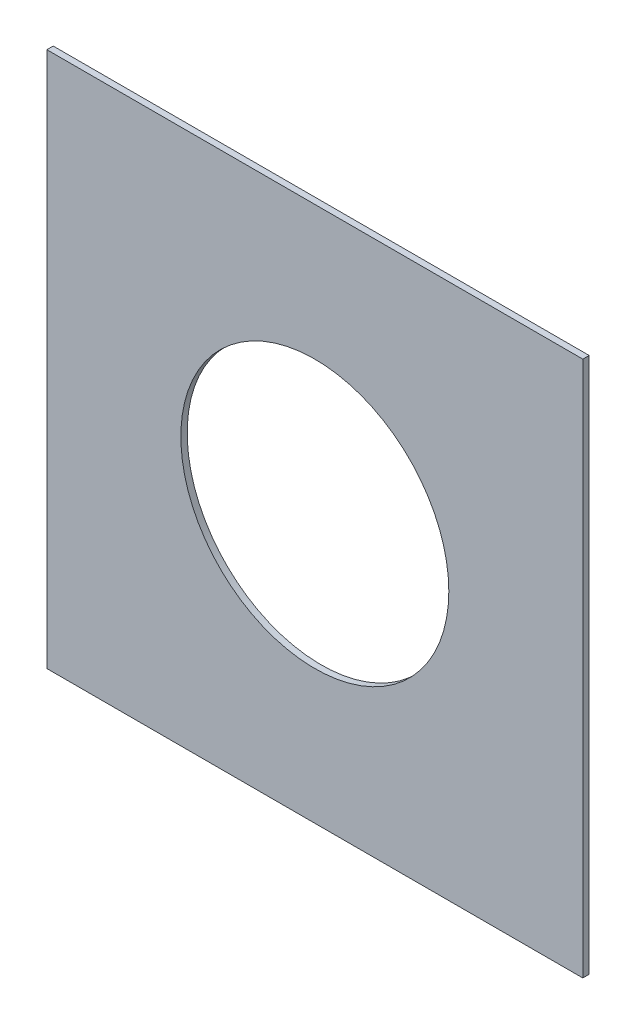
ISO-10303-21;
HEADER;
FILE_DESCRIPTION(('STEP AP214'),'2;1');
FILE_NAME('part.step','',(''),(''),'','','');
FILE_SCHEMA(('AUTOMOTIVE_DESIGN { 1 0 10303 214 1 1 1 1 }'));
ENDSEC;
DATA;
#1=APPLICATION_CONTEXT('core data for automotive mechanical design processes');
#2=APPLICATION_PROTOCOL_DEFINITION('international standard','automotive_design',2000,#1);
#3=PRODUCT_CONTEXT('',#1,'mechanical');
#4=PRODUCT('Part','Part','',(#3));
#5=PRODUCT_RELATED_PRODUCT_CATEGORY('part','',(#4));
#6=PRODUCT_DEFINITION_FORMATION('','',#4);
#7=PRODUCT_DEFINITION_CONTEXT('part definition',#1,'design');
#8=PRODUCT_DEFINITION('design','',#6,#7);
#9=PRODUCT_DEFINITION_SHAPE('','',#8);
#10=(LENGTH_UNIT() NAMED_UNIT(*) SI_UNIT(.MILLI.,.METRE.));
#11=(NAMED_UNIT(*) PLANE_ANGLE_UNIT() SI_UNIT($,.RADIAN.));
#12=(NAMED_UNIT(*) SI_UNIT($,.STERADIAN.) SOLID_ANGLE_UNIT());
#13=UNCERTAINTY_MEASURE_WITH_UNIT(LENGTH_MEASURE(1.E-05),#10,'distance_accuracy_value','');
#14=(GEOMETRIC_REPRESENTATION_CONTEXT(3) GLOBAL_UNCERTAINTY_ASSIGNED_CONTEXT((#13)) GLOBAL_UNIT_ASSIGNED_CONTEXT((#10,
#11,#12)) REPRESENTATION_CONTEXT('',''));
#15=CARTESIAN_POINT('',(0.,0.,0.));
#16=DIRECTION('',(0.,0.,1.));
#17=DIRECTION('',(1.,0.,0.));
#18=AXIS2_PLACEMENT_3D('',#15,#16,#17);
#19=CARTESIAN_POINT('',(97.9000015258789,44.,0.));
#20=DIRECTION('',(0.,-1.,0.));
#21=DIRECTION('',(-1.,0.,0.));
#22=AXIS2_PLACEMENT_3D('',#19,#20,#21);
#23=PLANE('',#22);
#24=DIRECTION('',(-1.,0.,0.));
#25=VECTOR('',#24,1.);
#26=CARTESIAN_POINT('',(97.9000015258789,44.,0.03556));
#27=LINE('',#26,#25);
#28=CARTESIAN_POINT('',(97.9000015258789,44.,0.03556));
#29=VERTEX_POINT('',#28);
#30=CARTESIAN_POINT('',(94.9000015258789,44.,0.03556));
#31=VERTEX_POINT('',#30);
#32=EDGE_CURVE('E11',#29,#31,#27,.T.);
#33=ORIENTED_EDGE('',*,*,#32,.F.);
#34=DIRECTION('',(0.,0.,1.));
#35=VECTOR('',#34,1.);
#36=CARTESIAN_POINT('',(97.9000015258789,44.,0.));
#37=LINE('',#36,#35);
#38=CARTESIAN_POINT('',(97.9000015258789,44.,0.));
#39=VERTEX_POINT('',#38);
#40=EDGE_CURVE('E24',#39,#29,#37,.T.);
#41=ORIENTED_EDGE('',*,*,#40,.F.);
#42=DIRECTION('',(-1.,0.,0.));
#43=VECTOR('',#42,1.);
#44=CARTESIAN_POINT('',(97.9000015258789,44.,0.));
#45=LINE('',#44,#43);
#46=CARTESIAN_POINT('',(94.9000015258789,44.,0.));
#47=VERTEX_POINT('',#46);
#48=EDGE_CURVE('E96',#39,#47,#45,.T.);
#49=ORIENTED_EDGE('',*,*,#48,.T.);
#50=DIRECTION('',(0.,0.,1.));
#51=VECTOR('',#50,1.);
#52=CARTESIAN_POINT('',(94.9000015258789,44.,0.));
#53=LINE('',#52,#51);
#54=EDGE_CURVE('E37',#47,#31,#53,.T.);
#55=ORIENTED_EDGE('',*,*,#54,.T.);
#56=EDGE_LOOP('',(#33,#41,#49,#55));
#57=FACE_BOUND('',#56,.T.);
#58=ADVANCED_FACE('F17',(#57),#23,.F.);
#59=CARTESIAN_POINT('',(94.9000015258789,44.,0.));
#60=DIRECTION('',(1.,0.,0.));
#61=DIRECTION('',(0.,-1.,0.));
#62=AXIS2_PLACEMENT_3D('',#59,#60,#61);
#63=PLANE('',#62);
#64=DIRECTION('',(0.,-1.,0.));
#65=VECTOR('',#64,1.);
#66=CARTESIAN_POINT('',(94.9000015258789,44.,0.03556));
#67=LINE('',#66,#65);
#68=CARTESIAN_POINT('',(94.9000015258789,41.,0.03556));
#69=VERTEX_POINT('',#68);
#70=EDGE_CURVE('E92',#31,#69,#67,.T.);
#71=ORIENTED_EDGE('',*,*,#70,.F.);
#72=ORIENTED_EDGE('',*,*,#54,.F.);
#73=DIRECTION('',(0.,-1.,0.));
#74=VECTOR('',#73,1.);
#75=CARTESIAN_POINT('',(94.9000015258789,44.,0.));
#76=LINE('',#75,#74);
#77=CARTESIAN_POINT('',(94.9000015258789,41.,0.));
#78=VERTEX_POINT('',#77);
#79=EDGE_CURVE('E89',#47,#78,#76,.T.);
#80=ORIENTED_EDGE('',*,*,#79,.T.);
#81=DIRECTION('',(0.,0.,1.));
#82=VECTOR('',#81,1.);
#83=CARTESIAN_POINT('',(94.9000015258789,41.,0.));
#84=LINE('',#83,#82);
#85=EDGE_CURVE('E87',#78,#69,#84,.T.);
#86=ORIENTED_EDGE('',*,*,#85,.T.);
#87=EDGE_LOOP('',(#71,#72,#80,#86));
#88=FACE_BOUND('',#87,.T.);
#89=ADVANCED_FACE('F104',(#88),#63,.F.);
#90=CARTESIAN_POINT('',(94.9000015258789,41.,0.));
#91=DIRECTION('',(0.,1.,0.));
#92=DIRECTION('',(1.,0.,0.));
#93=AXIS2_PLACEMENT_3D('',#90,#91,#92);
#94=PLANE('',#93);
#95=DIRECTION('',(1.,0.,0.));
#96=VECTOR('',#95,1.);
#97=CARTESIAN_POINT('',(94.9000015258789,41.,0.03556));
#98=LINE('',#97,#96);
#99=CARTESIAN_POINT('',(97.9000015258789,41.,0.03556));
#100=VERTEX_POINT('',#99);
#101=EDGE_CURVE('E84',#69,#100,#98,.T.);
#102=ORIENTED_EDGE('',*,*,#101,.F.);
#103=ORIENTED_EDGE('',*,*,#85,.F.);
#104=DIRECTION('',(1.,0.,0.));
#105=VECTOR('',#104,1.);
#106=CARTESIAN_POINT('',(94.9000015258789,41.,0.));
#107=LINE('',#106,#105);
#108=CARTESIAN_POINT('',(97.9000015258789,41.,0.));
#109=VERTEX_POINT('',#108);
#110=EDGE_CURVE('E81',#78,#109,#107,.T.);
#111=ORIENTED_EDGE('',*,*,#110,.T.);
#112=DIRECTION('',(0.,0.,1.));
#113=VECTOR('',#112,1.);
#114=CARTESIAN_POINT('',(97.9000015258789,41.,0.));
#115=LINE('',#114,#113);
#116=EDGE_CURVE('E79',#109,#100,#115,.T.);
#117=ORIENTED_EDGE('',*,*,#116,.T.);
#118=EDGE_LOOP('',(#102,#103,#111,#117));
#119=FACE_BOUND('',#118,.T.);
#120=ADVANCED_FACE('F110',(#119),#94,.F.);
#121=CARTESIAN_POINT('',(97.9000015258789,41.,0.));
#122=DIRECTION('',(-1.,0.,0.));
#123=DIRECTION('',(0.,1.,0.));
#124=AXIS2_PLACEMENT_3D('',#121,#122,#123);
#125=PLANE('',#124);
#126=DIRECTION('',(0.,1.,0.));
#127=VECTOR('',#126,1.);
#128=CARTESIAN_POINT('',(97.9000015258789,41.,0.03556));
#129=LINE('',#128,#127);
#130=EDGE_CURVE('E76',#100,#29,#129,.T.);
#131=ORIENTED_EDGE('',*,*,#130,.F.);
#132=ORIENTED_EDGE('',*,*,#116,.F.);
#133=DIRECTION('',(0.,1.,0.));
#134=VECTOR('',#133,1.);
#135=CARTESIAN_POINT('',(97.9000015258789,41.,0.));
#136=LINE('',#135,#134);
#137=EDGE_CURVE('E68',#109,#39,#136,.T.);
#138=ORIENTED_EDGE('',*,*,#137,.T.);
#139=ORIENTED_EDGE('',*,*,#40,.T.);
#140=EDGE_LOOP('',(#131,#132,#138,#139));
#141=FACE_BOUND('',#140,.T.);
#142=ADVANCED_FACE('F111',(#141),#125,.F.);
#143=CARTESIAN_POINT('',(96.4000104,42.4999912,0.));
#144=DIRECTION('',(0.,0.,-1.));
#145=DIRECTION('',(1.,0.,0.));
#146=AXIS2_PLACEMENT_3D('',#143,#144,#145);
#147=CYLINDRICAL_SURFACE('',#146,0.7499985);
#148=DIRECTION('',(0.,0.,1.));
#149=VECTOR('',#148,1.);
#150=CARTESIAN_POINT('',(97.1500089,42.4999912,0.));
#151=LINE('',#150,#149);
#152=CARTESIAN_POINT('',(97.1500089,42.4999912,0.));
#153=VERTEX_POINT('',#152);
#154=CARTESIAN_POINT('',(97.1500089,42.4999912,0.03556));
#155=VERTEX_POINT('',#154);
#156=EDGE_CURVE('E62',#153,#155,#151,.T.);
#157=ORIENTED_EDGE('',*,*,#156,.T.);
#158=CARTESIAN_POINT('',(96.4000104,42.4999912,0.03556));
#159=DIRECTION('',(0.,0.,1.));
#160=DIRECTION('',(1.,0.,0.));
#161=AXIS2_PLACEMENT_3D('',#158,#159,#160);
#162=CIRCLE('',#161,0.7499985);
#163=EDGE_CURVE('E67',#155,#155,#162,.T.);
#164=ORIENTED_EDGE('',*,*,#163,.T.);
#165=ORIENTED_EDGE('',*,*,#156,.F.);
#166=CARTESIAN_POINT('',(96.4000104,42.4999912,0.));
#167=DIRECTION('',(0.,0.,1.));
#168=DIRECTION('',(1.,0.,0.));
#169=AXIS2_PLACEMENT_3D('',#166,#167,#168);
#170=CIRCLE('',#169,0.7499985);
#171=EDGE_CURVE('E65',#153,#153,#170,.T.);
#172=ORIENTED_EDGE('',*,*,#171,.F.);
#173=EDGE_LOOP('',(#157,#164,#165,#172));
#174=FACE_BOUND('',#173,.T.);
#175=ADVANCED_FACE('F64',(#174),#147,.F.);
#176=CARTESIAN_POINT('',(97.9000015258789,44.,0.));
#177=DIRECTION('',(0.,0.,-1.));
#178=DIRECTION('',(-1.,0.,0.));
#179=AXIS2_PLACEMENT_3D('',#176,#177,#178);
#180=PLANE('',#179);
#181=ORIENTED_EDGE('',*,*,#137,.F.);
#182=ORIENTED_EDGE('',*,*,#110,.F.);
#183=ORIENTED_EDGE('',*,*,#79,.F.);
#184=ORIENTED_EDGE('',*,*,#48,.F.);
#185=EDGE_LOOP('',(#181,#182,#183,#184));
#186=FACE_BOUND('',#185,.T.);
#187=ORIENTED_EDGE('',*,*,#171,.T.);
#188=EDGE_LOOP('',(#187));
#189=FACE_BOUND('',#188,.T.);
#190=ADVANCED_FACE('F71',(#186,#189),#180,.T.);
#191=CARTESIAN_POINT('',(97.9000015258789,44.,0.03556));
#192=DIRECTION('',(0.,0.,-1.));
#193=DIRECTION('',(-1.,0.,0.));
#194=AXIS2_PLACEMENT_3D('',#191,#192,#193);
#195=PLANE('',#194);
#196=ORIENTED_EDGE('',*,*,#32,.T.);
#197=ORIENTED_EDGE('',*,*,#70,.T.);
#198=ORIENTED_EDGE('',*,*,#101,.T.);
#199=ORIENTED_EDGE('',*,*,#130,.T.);
#200=EDGE_LOOP('',(#196,#197,#198,#199));
#201=FACE_BOUND('',#200,.T.);
#202=ORIENTED_EDGE('',*,*,#163,.F.);
#203=EDGE_LOOP('',(#202));
#204=FACE_BOUND('',#203,.T.);
#205=ADVANCED_FACE('F107',(#201,#204),#195,.F.);
#206=CLOSED_SHELL('',(#58,#89,#120,#142,#175,#190,#205));
#207=MANIFOLD_SOLID_BREP('B1',#206);
#208=ADVANCED_BREP_SHAPE_REPRESENTATION('',(#18,#207),#14);
#209=SHAPE_DEFINITION_REPRESENTATION(#9,#208);
ENDSEC;
END-ISO-10303-21;
